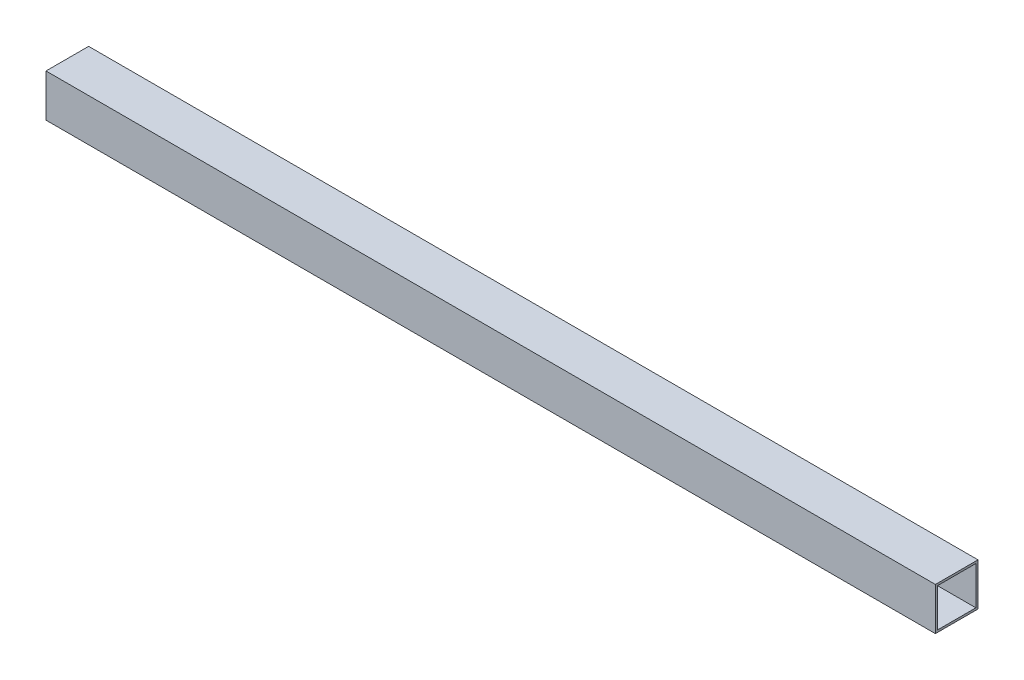
ISO-10303-21;
HEADER;
FILE_DESCRIPTION(('STEP AP214'),'2;1');
FILE_NAME('part.step','',(''),(''),'','','');
FILE_SCHEMA(('AUTOMOTIVE_DESIGN { 1 0 10303 214 1 1 1 1 }'));
ENDSEC;
DATA;
#1=APPLICATION_CONTEXT('core data for automotive mechanical design processes');
#2=APPLICATION_PROTOCOL_DEFINITION('international standard','automotive_design',2000,#1);
#3=PRODUCT_CONTEXT('',#1,'mechanical');
#4=PRODUCT('Part','Part','',(#3));
#5=PRODUCT_RELATED_PRODUCT_CATEGORY('part','',(#4));
#6=PRODUCT_DEFINITION_FORMATION('','',#4);
#7=PRODUCT_DEFINITION_CONTEXT('part definition',#1,'design');
#8=PRODUCT_DEFINITION('design','',#6,#7);
#9=PRODUCT_DEFINITION_SHAPE('','',#8);
#10=(LENGTH_UNIT() NAMED_UNIT(*) SI_UNIT(.MILLI.,.METRE.));
#11=(NAMED_UNIT(*) PLANE_ANGLE_UNIT() SI_UNIT($,.RADIAN.));
#12=(NAMED_UNIT(*) SI_UNIT($,.STERADIAN.) SOLID_ANGLE_UNIT());
#13=UNCERTAINTY_MEASURE_WITH_UNIT(LENGTH_MEASURE(1.E-05),#10,'distance_accuracy_value','');
#14=(GEOMETRIC_REPRESENTATION_CONTEXT(3) GLOBAL_UNCERTAINTY_ASSIGNED_CONTEXT((#13)) GLOBAL_UNIT_ASSIGNED_CONTEXT((#10,
#11,#12)) REPRESENTATION_CONTEXT('',''));
#15=CARTESIAN_POINT('',(0.,0.,0.));
#16=DIRECTION('',(0.,0.,1.));
#17=DIRECTION('',(1.,0.,0.));
#18=AXIS2_PLACEMENT_3D('',#15,#16,#17);
#19=CARTESIAN_POINT('',(530.,25.4,-25.4000000000001));
#20=DIRECTION('',(-1.,0.,0.));
#21=DIRECTION('',(0.,0.,1.));
#22=AXIS2_PLACEMENT_3D('',#19,#20,#21);
#23=PLANE('',#22);
#24=DIRECTION('',(0.,0.,-1.));
#25=VECTOR('',#24,1.);
#26=CARTESIAN_POINT('',(530.,1.27,-1.27));
#27=LINE('',#26,#25);
#28=CARTESIAN_POINT('',(530.,1.27,-1.27));
#29=VERTEX_POINT('',#28);
#30=CARTESIAN_POINT('',(530.,1.27,-24.1300000000001));
#31=VERTEX_POINT('',#30);
#32=EDGE_CURVE('E124',#29,#31,#27,.T.);
#33=ORIENTED_EDGE('',*,*,#32,.F.);
#34=DIRECTION('',(0.,-1.,0.));
#35=VECTOR('',#34,1.);
#36=CARTESIAN_POINT('',(530.,24.13,-1.26999999999999));
#37=LINE('',#36,#35);
#38=CARTESIAN_POINT('',(530.,24.13,-1.26999999999999));
#39=VERTEX_POINT('',#38);
#40=EDGE_CURVE('E47',#39,#29,#37,.T.);
#41=ORIENTED_EDGE('',*,*,#40,.F.);
#42=DIRECTION('',(0.,0.,1.));
#43=VECTOR('',#42,1.);
#44=CARTESIAN_POINT('',(530.,24.13,-1.26999999999999));
#45=LINE('',#44,#43);
#46=CARTESIAN_POINT('',(530.,24.13,-24.1300000000001));
#47=VERTEX_POINT('',#46);
#48=EDGE_CURVE('E115',#47,#39,#45,.T.);
#49=ORIENTED_EDGE('',*,*,#48,.F.);
#50=DIRECTION('',(0.,1.,0.));
#51=VECTOR('',#50,1.);
#52=CARTESIAN_POINT('',(530.,24.13,-24.1300000000001));
#53=LINE('',#52,#51);
#54=EDGE_CURVE('E118',#31,#47,#53,.T.);
#55=ORIENTED_EDGE('',*,*,#54,.F.);
#56=EDGE_LOOP('',(#33,#41,#49,#55));
#57=FACE_BOUND('',#56,.T.);
#58=DIRECTION('',(0.,0.,-1.));
#59=VECTOR('',#58,1.);
#60=CARTESIAN_POINT('',(530.,0.,-25.4000000000001));
#61=LINE('',#60,#59);
#62=CARTESIAN_POINT('',(530.,0.,0.));
#63=VERTEX_POINT('',#62);
#64=CARTESIAN_POINT('',(530.,0.,-25.4000000000001));
#65=VERTEX_POINT('',#64);
#66=EDGE_CURVE('E130',#63,#65,#61,.T.);
#67=ORIENTED_EDGE('',*,*,#66,.T.);
#68=DIRECTION('',(0.,-1.,0.));
#69=VECTOR('',#68,1.);
#70=CARTESIAN_POINT('',(530.,25.4,-25.4000000000001));
#71=LINE('',#70,#69);
#72=CARTESIAN_POINT('',(530.,25.4,-25.4000000000001));
#73=VERTEX_POINT('',#72);
#74=EDGE_CURVE('E11',#73,#65,#71,.T.);
#75=ORIENTED_EDGE('',*,*,#74,.F.);
#76=DIRECTION('',(0.,0.,-1.));
#77=VECTOR('',#76,1.);
#78=CARTESIAN_POINT('',(530.,25.4,-25.4000000000001));
#79=LINE('',#78,#77);
#80=CARTESIAN_POINT('',(530.,25.4,0.));
#81=VERTEX_POINT('',#80);
#82=EDGE_CURVE('E134',#81,#73,#79,.T.);
#83=ORIENTED_EDGE('',*,*,#82,.F.);
#84=DIRECTION('',(0.,-1.,0.));
#85=VECTOR('',#84,1.);
#86=CARTESIAN_POINT('',(530.,25.4,0.));
#87=LINE('',#86,#85);
#88=EDGE_CURVE('E144',#81,#63,#87,.T.);
#89=ORIENTED_EDGE('',*,*,#88,.T.);
#90=EDGE_LOOP('',(#67,#75,#83,#89));
#91=FACE_BOUND('',#90,.T.);
#92=ADVANCED_FACE('F33',(#57,#91),#23,.F.);
#93=CARTESIAN_POINT('',(530.,25.4,-25.4000000000001));
#94=DIRECTION('',(0.,0.,1.));
#95=DIRECTION('',(1.,0.,0.));
#96=AXIS2_PLACEMENT_3D('',#93,#94,#95);
#97=PLANE('',#96);
#98=DIRECTION('',(-1.,0.,0.));
#99=VECTOR('',#98,1.);
#100=CARTESIAN_POINT('',(530.,0.,-25.4000000000001));
#101=LINE('',#100,#99);
#102=CARTESIAN_POINT('',(0.,0.,-25.4));
#103=VERTEX_POINT('',#102);
#104=EDGE_CURVE('E147',#65,#103,#101,.T.);
#105=ORIENTED_EDGE('',*,*,#104,.T.);
#106=DIRECTION('',(0.,-1.,0.));
#107=VECTOR('',#106,1.);
#108=CARTESIAN_POINT('',(0.,25.4,-25.4));
#109=LINE('',#108,#107);
#110=CARTESIAN_POINT('',(0.,25.4,-25.4));
#111=VERTEX_POINT('',#110);
#112=EDGE_CURVE('E40',#111,#103,#109,.T.);
#113=ORIENTED_EDGE('',*,*,#112,.F.);
#114=DIRECTION('',(-1.,0.,0.));
#115=VECTOR('',#114,1.);
#116=CARTESIAN_POINT('',(530.,25.4,-25.4000000000001));
#117=LINE('',#116,#115);
#118=EDGE_CURVE('E137',#73,#111,#117,.T.);
#119=ORIENTED_EDGE('',*,*,#118,.F.);
#120=ORIENTED_EDGE('',*,*,#74,.T.);
#121=EDGE_LOOP('',(#105,#113,#119,#120));
#122=FACE_BOUND('',#121,.T.);
#123=ADVANCED_FACE('F175',(#122),#97,.F.);
#124=CARTESIAN_POINT('',(0.,25.4,-25.4));
#125=DIRECTION('',(1.,0.,0.));
#126=DIRECTION('',(0.,0.,-1.));
#127=AXIS2_PLACEMENT_3D('',#124,#125,#126);
#128=PLANE('',#127);
#129=DIRECTION('',(0.,0.,1.));
#130=VECTOR('',#129,1.);
#131=CARTESIAN_POINT('',(0.,24.13,-1.26999999999999));
#132=LINE('',#131,#130);
#133=CARTESIAN_POINT('',(0.,24.13,-24.1300000000001));
#134=VERTEX_POINT('',#133);
#135=CARTESIAN_POINT('',(0.,24.13,-1.26999999999999));
#136=VERTEX_POINT('',#135);
#137=EDGE_CURVE('E105',#134,#136,#132,.T.);
#138=ORIENTED_EDGE('',*,*,#137,.T.);
#139=DIRECTION('',(0.,-1.,0.));
#140=VECTOR('',#139,1.);
#141=CARTESIAN_POINT('',(0.,24.13,-1.26999999999999));
#142=LINE('',#141,#140);
#143=CARTESIAN_POINT('',(0.,1.27,-1.27));
#144=VERTEX_POINT('',#143);
#145=EDGE_CURVE('E99',#136,#144,#142,.T.);
#146=ORIENTED_EDGE('',*,*,#145,.T.);
#147=DIRECTION('',(0.,0.,-1.));
#148=VECTOR('',#147,1.);
#149=CARTESIAN_POINT('',(0.,1.27,-1.27));
#150=LINE('',#149,#148);
#151=CARTESIAN_POINT('',(0.,1.27,-24.1300000000001));
#152=VERTEX_POINT('',#151);
#153=EDGE_CURVE('E108',#144,#152,#150,.T.);
#154=ORIENTED_EDGE('',*,*,#153,.T.);
#155=DIRECTION('',(0.,1.,0.));
#156=VECTOR('',#155,1.);
#157=CARTESIAN_POINT('',(0.,24.13,-24.1300000000001));
#158=LINE('',#157,#156);
#159=EDGE_CURVE('E55',#152,#134,#158,.T.);
#160=ORIENTED_EDGE('',*,*,#159,.T.);
#161=EDGE_LOOP('',(#138,#146,#154,#160));
#162=FACE_BOUND('',#161,.T.);
#163=DIRECTION('',(0.,0.,1.));
#164=VECTOR('',#163,1.);
#165=CARTESIAN_POINT('',(0.,0.,-25.4));
#166=LINE('',#165,#164);
#167=CARTESIAN_POINT('',(0.,0.,0.));
#168=VERTEX_POINT('',#167);
#169=EDGE_CURVE('E149',#103,#168,#166,.T.);
#170=ORIENTED_EDGE('',*,*,#169,.T.);
#171=DIRECTION('',(0.,-1.,0.));
#172=VECTOR('',#171,1.);
#173=CARTESIAN_POINT('',(0.,25.4,0.));
#174=LINE('',#173,#172);
#175=CARTESIAN_POINT('',(0.,25.4,0.));
#176=VERTEX_POINT('',#175);
#177=EDGE_CURVE('E154',#176,#168,#174,.T.);
#178=ORIENTED_EDGE('',*,*,#177,.F.);
#179=DIRECTION('',(0.,0.,1.));
#180=VECTOR('',#179,1.);
#181=CARTESIAN_POINT('',(0.,25.4,-25.4));
#182=LINE('',#181,#180);
#183=EDGE_CURVE('E140',#111,#176,#182,.T.);
#184=ORIENTED_EDGE('',*,*,#183,.F.);
#185=ORIENTED_EDGE('',*,*,#112,.T.);
#186=EDGE_LOOP('',(#170,#178,#184,#185));
#187=FACE_BOUND('',#186,.T.);
#188=ADVANCED_FACE('F112',(#162,#187),#128,.F.);
#189=CARTESIAN_POINT('',(530.,25.4,0.));
#190=DIRECTION('',(0.,0.,-1.));
#191=DIRECTION('',(-1.,0.,0.));
#192=AXIS2_PLACEMENT_3D('',#189,#190,#191);
#193=PLANE('',#192);
#194=DIRECTION('',(1.,0.,0.));
#195=VECTOR('',#194,1.);
#196=CARTESIAN_POINT('',(530.,0.,0.));
#197=LINE('',#196,#195);
#198=EDGE_CURVE('E138',#168,#63,#197,.T.);
#199=ORIENTED_EDGE('',*,*,#198,.T.);
#200=ORIENTED_EDGE('',*,*,#88,.F.);
#201=DIRECTION('',(1.,0.,0.));
#202=VECTOR('',#201,1.);
#203=CARTESIAN_POINT('',(530.,25.4,0.));
#204=LINE('',#203,#202);
#205=EDGE_CURVE('E142',#176,#81,#204,.T.);
#206=ORIENTED_EDGE('',*,*,#205,.F.);
#207=ORIENTED_EDGE('',*,*,#177,.T.);
#208=EDGE_LOOP('',(#199,#200,#206,#207));
#209=FACE_BOUND('',#208,.T.);
#210=ADVANCED_FACE('F168',(#209),#193,.F.);
#211=CARTESIAN_POINT('',(0.,25.4,0.));
#212=DIRECTION('',(0.,-1.,0.));
#213=DIRECTION('',(0.,0.,-1.));
#214=AXIS2_PLACEMENT_3D('',#211,#212,#213);
#215=PLANE('',#214);
#216=ORIENTED_EDGE('',*,*,#82,.T.);
#217=ORIENTED_EDGE('',*,*,#118,.T.);
#218=ORIENTED_EDGE('',*,*,#183,.T.);
#219=ORIENTED_EDGE('',*,*,#205,.T.);
#220=EDGE_LOOP('',(#216,#217,#218,#219));
#221=FACE_BOUND('',#220,.T.);
#222=ADVANCED_FACE('F174',(#221),#215,.F.);
#223=CARTESIAN_POINT('',(0.,0.,0.));
#224=DIRECTION('',(0.,-1.,0.));
#225=DIRECTION('',(0.,0.,-1.));
#226=AXIS2_PLACEMENT_3D('',#223,#224,#225);
#227=PLANE('',#226);
#228=ORIENTED_EDGE('',*,*,#66,.F.);
#229=ORIENTED_EDGE('',*,*,#198,.F.);
#230=ORIENTED_EDGE('',*,*,#169,.F.);
#231=ORIENTED_EDGE('',*,*,#104,.F.);
#232=EDGE_LOOP('',(#228,#229,#230,#231));
#233=FACE_BOUND('',#232,.T.);
#234=ADVANCED_FACE('F165',(#233),#227,.T.);
#235=CARTESIAN_POINT('',(0.,24.13,-1.26999999999999));
#236=DIRECTION('',(0.,0.,1.));
#237=DIRECTION('',(0.,-1.,0.));
#238=AXIS2_PLACEMENT_3D('',#235,#236,#237);
#239=PLANE('',#238);
#240=ORIENTED_EDGE('',*,*,#40,.T.);
#241=DIRECTION('',(1.,0.,0.));
#242=VECTOR('',#241,1.);
#243=CARTESIAN_POINT('',(0.,1.27,-1.27));
#244=LINE('',#243,#242);
#245=EDGE_CURVE('E95',#144,#29,#244,.T.);
#246=ORIENTED_EDGE('',*,*,#245,.F.);
#247=ORIENTED_EDGE('',*,*,#145,.F.);
#248=DIRECTION('',(1.,0.,0.));
#249=VECTOR('',#248,1.);
#250=CARTESIAN_POINT('',(0.,24.13,-1.26999999999999));
#251=LINE('',#250,#249);
#252=EDGE_CURVE('E128',#136,#39,#251,.T.);
#253=ORIENTED_EDGE('',*,*,#252,.T.);
#254=EDGE_LOOP('',(#240,#246,#247,#253));
#255=FACE_BOUND('',#254,.T.);
#256=ADVANCED_FACE('F97',(#255),#239,.F.);
#257=CARTESIAN_POINT('',(0.,24.13,-1.26999999999999));
#258=DIRECTION('',(0.,1.,0.));
#259=DIRECTION('',(0.,0.,1.));
#260=AXIS2_PLACEMENT_3D('',#257,#258,#259);
#261=PLANE('',#260);
#262=ORIENTED_EDGE('',*,*,#48,.T.);
#263=ORIENTED_EDGE('',*,*,#252,.F.);
#264=ORIENTED_EDGE('',*,*,#137,.F.);
#265=DIRECTION('',(1.,0.,0.));
#266=VECTOR('',#265,1.);
#267=CARTESIAN_POINT('',(0.,24.13,-24.1300000000001));
#268=LINE('',#267,#266);
#269=EDGE_CURVE('E131',#134,#47,#268,.T.);
#270=ORIENTED_EDGE('',*,*,#269,.T.);
#271=EDGE_LOOP('',(#262,#263,#264,#270));
#272=FACE_BOUND('',#271,.T.);
#273=ADVANCED_FACE('F192',(#272),#261,.F.);
#274=CARTESIAN_POINT('',(0.,24.13,-24.1300000000001));
#275=DIRECTION('',(0.,0.,-1.));
#276=DIRECTION('',(0.,1.,0.));
#277=AXIS2_PLACEMENT_3D('',#274,#275,#276);
#278=PLANE('',#277);
#279=ORIENTED_EDGE('',*,*,#54,.T.);
#280=ORIENTED_EDGE('',*,*,#269,.F.);
#281=ORIENTED_EDGE('',*,*,#159,.F.);
#282=DIRECTION('',(1.,0.,0.));
#283=VECTOR('',#282,1.);
#284=CARTESIAN_POINT('',(0.,1.27,-24.1300000000001));
#285=LINE('',#284,#283);
#286=EDGE_CURVE('E104',#152,#31,#285,.T.);
#287=ORIENTED_EDGE('',*,*,#286,.T.);
#288=EDGE_LOOP('',(#279,#280,#281,#287));
#289=FACE_BOUND('',#288,.T.);
#290=ADVANCED_FACE('F195',(#289),#278,.F.);
#291=CARTESIAN_POINT('',(0.,1.27,-1.27));
#292=DIRECTION('',(0.,-1.,0.));
#293=DIRECTION('',(0.,0.,-1.));
#294=AXIS2_PLACEMENT_3D('',#291,#292,#293);
#295=PLANE('',#294);
#296=ORIENTED_EDGE('',*,*,#32,.T.);
#297=ORIENTED_EDGE('',*,*,#286,.F.);
#298=ORIENTED_EDGE('',*,*,#153,.F.);
#299=ORIENTED_EDGE('',*,*,#245,.T.);
#300=EDGE_LOOP('',(#296,#297,#298,#299));
#301=FACE_BOUND('',#300,.T.);
#302=ADVANCED_FACE('F109',(#301),#295,.F.);
#303=CLOSED_SHELL('',(#92,#123,#188,#210,#222,#234,#256,#273,#290,#302));
#304=MANIFOLD_SOLID_BREP('B2',#303);
#305=ADVANCED_BREP_SHAPE_REPRESENTATION('',(#18,#304),#14);
#306=SHAPE_DEFINITION_REPRESENTATION(#9,#305);
ENDSEC;
END-ISO-10303-21;
